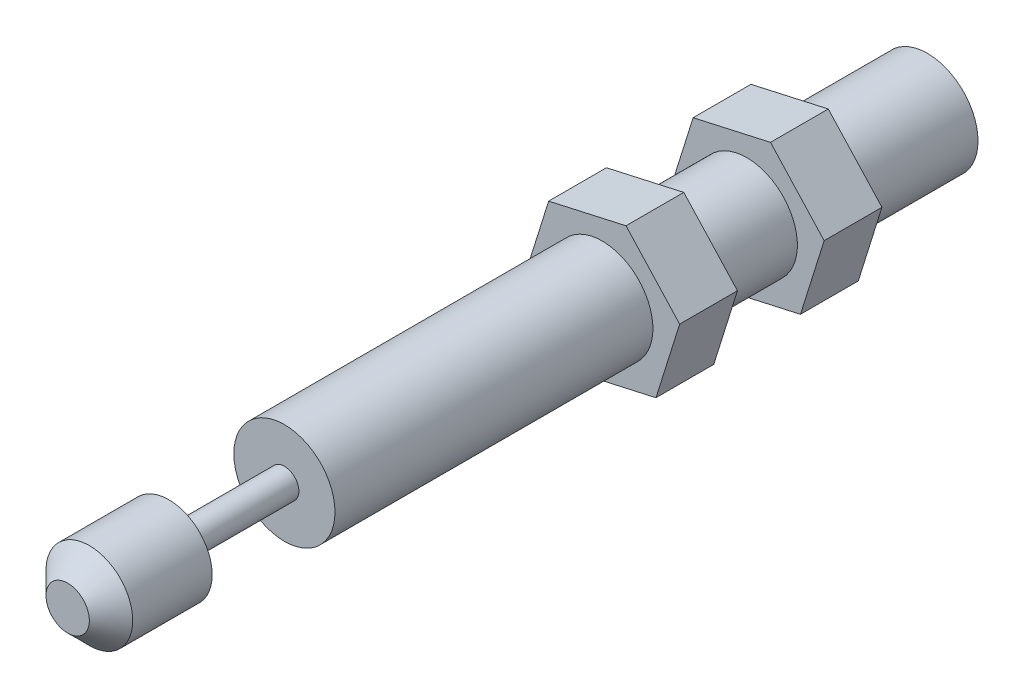
ISO-10303-21;
HEADER;
FILE_DESCRIPTION(('STEP AP214'),'2;1');
FILE_NAME('part.step','',(''),(''),'','','');
FILE_SCHEMA(('AUTOMOTIVE_DESIGN { 1 0 10303 214 1 1 1 1 }'));
ENDSEC;
DATA;
#1=APPLICATION_CONTEXT('core data for automotive mechanical design processes');
#2=APPLICATION_PROTOCOL_DEFINITION('international standard','automotive_design',2000,#1);
#3=PRODUCT_CONTEXT('',#1,'mechanical');
#4=PRODUCT('Part','Part','',(#3));
#5=PRODUCT_RELATED_PRODUCT_CATEGORY('part','',(#4));
#6=PRODUCT_DEFINITION_FORMATION('','',#4);
#7=PRODUCT_DEFINITION_CONTEXT('part definition',#1,'design');
#8=PRODUCT_DEFINITION('design','',#6,#7);
#9=PRODUCT_DEFINITION_SHAPE('','',#8);
#10=(LENGTH_UNIT() NAMED_UNIT(*) SI_UNIT(.MILLI.,.METRE.));
#11=(NAMED_UNIT(*) PLANE_ANGLE_UNIT() SI_UNIT($,.RADIAN.));
#12=(NAMED_UNIT(*) SI_UNIT($,.STERADIAN.) SOLID_ANGLE_UNIT());
#13=UNCERTAINTY_MEASURE_WITH_UNIT(LENGTH_MEASURE(1.E-05),#10,'distance_accuracy_value','');
#14=(GEOMETRIC_REPRESENTATION_CONTEXT(3) GLOBAL_UNCERTAINTY_ASSIGNED_CONTEXT((#13)) GLOBAL_UNIT_ASSIGNED_CONTEXT((#10,
#11,#12)) REPRESENTATION_CONTEXT('',''));
#15=CARTESIAN_POINT('',(0.,0.,0.));
#16=DIRECTION('',(0.,0.,1.));
#17=DIRECTION('',(1.,0.,0.));
#18=AXIS2_PLACEMENT_3D('',#15,#16,#17);
#19=CARTESIAN_POINT('',(0.,0.,89.));
#20=DIRECTION('',(0.,0.,-1.));
#21=DIRECTION('',(-1.,0.,0.));
#22=AXIS2_PLACEMENT_3D('',#19,#20,#21);
#23=CYLINDRICAL_SURFACE('',#22,7.);
#24=CARTESIAN_POINT('',(0.,0.,89.));
#25=DIRECTION('',(0.,0.,1.));
#26=DIRECTION('',(1.,0.,0.));
#27=AXIS2_PLACEMENT_3D('',#24,#25,#26);
#28=CIRCLE('',#27,7.);
#29=CARTESIAN_POINT('',(7.,0.,89.));
#30=VERTEX_POINT('',#29);
#31=EDGE_CURVE('E156',#30,#30,#28,.T.);
#32=ORIENTED_EDGE('',*,*,#31,.F.);
#33=EDGE_LOOP('',(#32));
#34=FACE_BOUND('',#33,.T.);
#35=CARTESIAN_POINT('',(0.,0.,45.));
#36=DIRECTION('',(0.,0.,-1.));
#37=DIRECTION('',(-1.,0.,0.));
#38=AXIS2_PLACEMENT_3D('',#35,#36,#37);
#39=CIRCLE('',#38,7.);
#40=CARTESIAN_POINT('',(-7.,0.,45.));
#41=VERTEX_POINT('',#40);
#42=EDGE_CURVE('E11',#41,#41,#39,.T.);
#43=ORIENTED_EDGE('',*,*,#42,.F.);
#44=EDGE_LOOP('',(#43));
#45=FACE_BOUND('',#44,.T.);
#46=ADVANCED_FACE('F34',(#34,#45),#23,.T.);
#47=CARTESIAN_POINT('',(0.,0.,89.));
#48=DIRECTION('',(0.,0.,1.));
#49=DIRECTION('',(1.,0.,0.));
#50=AXIS2_PLACEMENT_3D('',#47,#48,#49);
#51=PLANE('',#50);
#52=ORIENTED_EDGE('',*,*,#31,.T.);
#53=EDGE_LOOP('',(#52));
#54=FACE_BOUND('',#53,.T.);
#55=CARTESIAN_POINT('',(0.,0.,89.));
#56=DIRECTION('',(0.,0.,1.));
#57=DIRECTION('',(1.,0.,0.));
#58=AXIS2_PLACEMENT_3D('',#55,#56,#57);
#59=CIRCLE('',#58,2.);
#60=CARTESIAN_POINT('',(2.,0.,89.));
#61=VERTEX_POINT('',#60);
#62=EDGE_CURVE('E149',#61,#61,#59,.T.);
#63=ORIENTED_EDGE('',*,*,#62,.F.);
#64=EDGE_LOOP('',(#63));
#65=FACE_BOUND('',#64,.T.);
#66=ADVANCED_FACE('F188',(#54,#65),#51,.T.);
#67=CARTESIAN_POINT('',(0.,0.,105.));
#68=DIRECTION('',(0.,0.,-1.));
#69=DIRECTION('',(-1.,0.,0.));
#70=AXIS2_PLACEMENT_3D('',#67,#68,#69);
#71=CYLINDRICAL_SURFACE('',#70,2.);
#72=CARTESIAN_POINT('',(0.,0.,105.));
#73=DIRECTION('',(0.,0.,1.));
#74=DIRECTION('',(1.,0.,0.));
#75=AXIS2_PLACEMENT_3D('',#72,#73,#74);
#76=CIRCLE('',#75,2.);
#77=CARTESIAN_POINT('',(2.,0.,105.));
#78=VERTEX_POINT('',#77);
#79=EDGE_CURVE('E150',#78,#78,#76,.T.);
#80=ORIENTED_EDGE('',*,*,#79,.F.);
#81=EDGE_LOOP('',(#80));
#82=FACE_BOUND('',#81,.T.);
#83=ORIENTED_EDGE('',*,*,#62,.T.);
#84=EDGE_LOOP('',(#83));
#85=FACE_BOUND('',#84,.T.);
#86=ADVANCED_FACE('F193',(#82,#85),#71,.T.);
#87=CARTESIAN_POINT('',(0.,0.,105.));
#88=DIRECTION('',(0.,0.,1.));
#89=DIRECTION('',(1.,0.,0.));
#90=AXIS2_PLACEMENT_3D('',#87,#88,#89);
#91=PLANE('',#90);
#92=CARTESIAN_POINT('',(0.,0.,105.));
#93=DIRECTION('',(0.,0.,1.));
#94=DIRECTION('',(1.,0.,0.));
#95=AXIS2_PLACEMENT_3D('',#92,#93,#94);
#96=CIRCLE('',#95,6.);
#97=CARTESIAN_POINT('',(6.,0.,105.));
#98=VERTEX_POINT('',#97);
#99=EDGE_CURVE('E146',#98,#98,#96,.T.);
#100=ORIENTED_EDGE('',*,*,#99,.F.);
#101=EDGE_LOOP('',(#100));
#102=FACE_BOUND('',#101,.T.);
#103=ORIENTED_EDGE('',*,*,#79,.T.);
#104=EDGE_LOOP('',(#103));
#105=FACE_BOUND('',#104,.T.);
#106=ADVANCED_FACE('F254',(#102,#105),#91,.F.);
#107=CARTESIAN_POINT('',(0.,0.,119.));
#108=DIRECTION('',(0.,0.,-1.));
#109=DIRECTION('',(-1.,0.,0.));
#110=AXIS2_PLACEMENT_3D('',#107,#108,#109);
#111=CYLINDRICAL_SURFACE('',#110,6.);
#112=CARTESIAN_POINT('',(0.,0.,116.));
#113=DIRECTION('',(0.,0.,1.));
#114=DIRECTION('',(1.,0.,0.));
#115=AXIS2_PLACEMENT_3D('',#112,#113,#114);
#116=CIRCLE('',#115,6.);
#117=CARTESIAN_POINT('',(6.,0.,116.));
#118=VERTEX_POINT('',#117);
#119=EDGE_CURVE('E164',#118,#118,#116,.F.);
#120=ORIENTED_EDGE('',*,*,#119,.T.);
#121=EDGE_LOOP('',(#120));
#122=FACE_BOUND('',#121,.T.);
#123=ORIENTED_EDGE('',*,*,#99,.T.);
#124=EDGE_LOOP('',(#123));
#125=FACE_BOUND('',#124,.T.);
#126=ADVANCED_FACE('F252',(#122,#125),#111,.T.);
#127=CARTESIAN_POINT('',(0.,0.,119.));
#128=DIRECTION('',(0.,0.,1.));
#129=DIRECTION('',(1.,0.,0.));
#130=AXIS2_PLACEMENT_3D('',#127,#128,#129);
#131=PLANE('',#130);
#132=CARTESIAN_POINT('',(0.,0.,119.));
#133=DIRECTION('',(0.,0.,1.));
#134=DIRECTION('',(1.,0.,0.));
#135=AXIS2_PLACEMENT_3D('',#132,#133,#134);
#136=CIRCLE('',#135,2.99999999999996);
#137=CARTESIAN_POINT('',(2.99999999999996,0.,119.));
#138=VERTEX_POINT('',#137);
#139=EDGE_CURVE('E159',#138,#138,#136,.T.);
#140=ORIENTED_EDGE('',*,*,#139,.T.);
#141=EDGE_LOOP('',(#140));
#142=FACE_BOUND('',#141,.T.);
#143=ADVANCED_FACE('F249',(#142),#131,.T.);
#144=CARTESIAN_POINT('',(0.,0.,119.));
#145=DIRECTION('',(0.,0.,-1.));
#146=DIRECTION('',(-1.,0.,0.));
#147=AXIS2_PLACEMENT_3D('',#144,#145,#146);
#148=CONICAL_SURFACE('',#147,2.99999999999996,0.785398163397448);
#149=ORIENTED_EDGE('',*,*,#119,.F.);
#150=EDGE_LOOP('',(#149));
#151=FACE_BOUND('',#150,.T.);
#152=ORIENTED_EDGE('',*,*,#139,.F.);
#153=EDGE_LOOP('',(#152));
#154=FACE_BOUND('',#153,.T.);
#155=ADVANCED_FACE('F36',(#151,#154),#148,.T.);
#156=CARTESIAN_POINT('',(3.27780569084184,10.4684919251255,37.));
#157=DIRECTION('',(0.,0.,-1.));
#158=DIRECTION('',(-1.,0.,0.));
#159=AXIS2_PLACEMENT_3D('',#156,#157,#158);
#160=PLANE('',#159);
#161=DIRECTION('',(0.975863204454027,0.218382705800432,0.));
#162=VECTOR('',#161,1.);
#163=CARTESIAN_POINT('',(-7.42707710105005,8.07290895950099,37.));
#164=LINE('',#163,#162);
#165=CARTESIAN_POINT('',(-7.42707710105005,8.07290895950099,37.));
#166=VERTEX_POINT('',#165);
#167=CARTESIAN_POINT('',(3.27780569084183,10.4684919251255,37.));
#168=VERTEX_POINT('',#167);
#169=EDGE_CURVE('E330',#166,#168,#164,.T.);
#170=ORIENTED_EDGE('',*,*,#169,.T.);
#171=DIRECTION('',(0.677056573197371,-0.735930972775459,0.));
#172=VECTOR('',#171,1.);
#173=CARTESIAN_POINT('',(3.27780569084183,10.4684919251255,37.));
#174=LINE('',#173,#172);
#175=CARTESIAN_POINT('',(10.7048827918919,2.39558296562453,37.));
#176=VERTEX_POINT('',#175);
#177=EDGE_CURVE('E370',#168,#176,#174,.T.);
#178=ORIENTED_EDGE('',*,*,#177,.T.);
#179=DIRECTION('',(-0.298806631256656,-0.954313678575891,0.));
#180=VECTOR('',#179,1.);
#181=CARTESIAN_POINT('',(10.7048827918919,2.39558296562453,37.));
#182=LINE('',#181,#180);
#183=CARTESIAN_POINT('',(7.42707710105005,-8.07290895950099,37.));
#184=VERTEX_POINT('',#183);
#185=EDGE_CURVE('E365',#176,#184,#182,.T.);
#186=ORIENTED_EDGE('',*,*,#185,.T.);
#187=DIRECTION('',(-0.975863204454027,-0.218382705800433,0.));
#188=VECTOR('',#187,1.);
#189=CARTESIAN_POINT('',(7.42707710105005,-8.07290895950099,37.));
#190=LINE('',#189,#188);
#191=CARTESIAN_POINT('',(-3.27780569084183,-10.4684919251255,37.));
#192=VERTEX_POINT('',#191);
#193=EDGE_CURVE('E346',#184,#192,#190,.T.);
#194=ORIENTED_EDGE('',*,*,#193,.T.);
#195=DIRECTION('',(-0.677056573197371,0.735930972775459,0.));
#196=VECTOR('',#195,1.);
#197=CARTESIAN_POINT('',(-3.27780569084183,-10.4684919251255,37.));
#198=LINE('',#197,#196);
#199=CARTESIAN_POINT('',(-10.7048827918919,-2.39558296562453,37.));
#200=VERTEX_POINT('',#199);
#201=EDGE_CURVE('E364',#192,#200,#198,.T.);
#202=ORIENTED_EDGE('',*,*,#201,.T.);
#203=DIRECTION('',(0.298806631256656,0.954313678575891,0.));
#204=VECTOR('',#203,1.);
#205=CARTESIAN_POINT('',(-10.7048827918919,-2.39558296562453,37.));
#206=LINE('',#205,#204);
#207=EDGE_CURVE('E317',#200,#166,#206,.T.);
#208=ORIENTED_EDGE('',*,*,#207,.T.);
#209=EDGE_LOOP('',(#170,#178,#186,#194,#202,#208));
#210=FACE_BOUND('',#209,.T.);
#211=CARTESIAN_POINT('',(0.,0.,37.));
#212=DIRECTION('',(0.,0.,-1.));
#213=DIRECTION('',(-1.,0.,0.));
#214=AXIS2_PLACEMENT_3D('',#211,#212,#213);
#215=CIRCLE('',#214,7.);
#216=CARTESIAN_POINT('',(-7.,0.,37.));
#217=VERTEX_POINT('',#216);
#218=EDGE_CURVE('E38',#217,#217,#215,.T.);
#219=ORIENTED_EDGE('',*,*,#218,.F.);
#220=EDGE_LOOP('',(#219));
#221=FACE_BOUND('',#220,.T.);
#222=ADVANCED_FACE('F299',(#210,#221),#160,.T.);
#223=CARTESIAN_POINT('',(3.27780569084184,10.4684919251255,45.));
#224=DIRECTION('',(0.,0.,-1.));
#225=DIRECTION('',(-1.,0.,0.));
#226=AXIS2_PLACEMENT_3D('',#223,#224,#225);
#227=PLANE('',#226);
#228=DIRECTION('',(0.975863204454027,0.218382705800432,0.));
#229=VECTOR('',#228,1.);
#230=CARTESIAN_POINT('',(-7.42707710105005,8.07290895950099,45.));
#231=LINE('',#230,#229);
#232=CARTESIAN_POINT('',(-7.42707710105005,8.07290895950099,45.));
#233=VERTEX_POINT('',#232);
#234=CARTESIAN_POINT('',(3.27780569084183,10.4684919251255,45.));
#235=VERTEX_POINT('',#234);
#236=EDGE_CURVE('E303',#233,#235,#231,.T.);
#237=ORIENTED_EDGE('',*,*,#236,.F.);
#238=DIRECTION('',(0.298806631256656,0.954313678575891,0.));
#239=VECTOR('',#238,1.);
#240=CARTESIAN_POINT('',(-10.7048827918919,-2.39558296562453,45.));
#241=LINE('',#240,#239);
#242=CARTESIAN_POINT('',(-10.7048827918919,-2.39558296562453,45.));
#243=VERTEX_POINT('',#242);
#244=EDGE_CURVE('E328',#243,#233,#241,.T.);
#245=ORIENTED_EDGE('',*,*,#244,.F.);
#246=DIRECTION('',(-0.677056573197371,0.735930972775459,0.));
#247=VECTOR('',#246,1.);
#248=CARTESIAN_POINT('',(-3.27780569084183,-10.4684919251255,45.));
#249=LINE('',#248,#247);
#250=CARTESIAN_POINT('',(-3.27780569084183,-10.4684919251255,45.));
#251=VERTEX_POINT('',#250);
#252=EDGE_CURVE('E325',#251,#243,#249,.T.);
#253=ORIENTED_EDGE('',*,*,#252,.F.);
#254=DIRECTION('',(-0.975863204454027,-0.218382705800433,0.));
#255=VECTOR('',#254,1.);
#256=CARTESIAN_POINT('',(7.42707710105005,-8.07290895950099,45.));
#257=LINE('',#256,#255);
#258=CARTESIAN_POINT('',(7.42707710105005,-8.07290895950099,45.));
#259=VERTEX_POINT('',#258);
#260=EDGE_CURVE('E322',#259,#251,#257,.T.);
#261=ORIENTED_EDGE('',*,*,#260,.F.);
#262=DIRECTION('',(-0.298806631256656,-0.954313678575891,0.));
#263=VECTOR('',#262,1.);
#264=CARTESIAN_POINT('',(10.7048827918919,2.39558296562453,45.));
#265=LINE('',#264,#263);
#266=CARTESIAN_POINT('',(10.7048827918919,2.39558296562453,45.));
#267=VERTEX_POINT('',#266);
#268=EDGE_CURVE('E314',#267,#259,#265,.T.);
#269=ORIENTED_EDGE('',*,*,#268,.F.);
#270=DIRECTION('',(0.677056573197371,-0.735930972775459,0.));
#271=VECTOR('',#270,1.);
#272=CARTESIAN_POINT('',(3.27780569084183,10.4684919251255,45.));
#273=LINE('',#272,#271);
#274=EDGE_CURVE('E312',#235,#267,#273,.T.);
#275=ORIENTED_EDGE('',*,*,#274,.F.);
#276=EDGE_LOOP('',(#237,#245,#253,#261,#269,#275));
#277=FACE_BOUND('',#276,.T.);
#278=ORIENTED_EDGE('',*,*,#42,.T.);
#279=EDGE_LOOP('',(#278));
#280=FACE_BOUND('',#279,.T.);
#281=ADVANCED_FACE('F281',(#277,#280),#227,.F.);
#282=CARTESIAN_POINT('',(-7.42707710105005,8.07290895950099,37.));
#283=DIRECTION('',(0.218382705800432,-0.975863204454027,0.));
#284=DIRECTION('',(0.975863204454027,0.218382705800432,0.));
#285=AXIS2_PLACEMENT_3D('',#282,#283,#284);
#286=PLANE('',#285);
#287=ORIENTED_EDGE('',*,*,#236,.T.);
#288=DIRECTION('',(0.,0.,1.));
#289=VECTOR('',#288,1.);
#290=CARTESIAN_POINT('',(3.27780569084183,10.4684919251255,37.));
#291=LINE('',#290,#289);
#292=EDGE_CURVE('E213',#168,#235,#291,.T.);
#293=ORIENTED_EDGE('',*,*,#292,.F.);
#294=ORIENTED_EDGE('',*,*,#169,.F.);
#295=DIRECTION('',(0.,0.,1.));
#296=VECTOR('',#295,1.);
#297=CARTESIAN_POINT('',(-7.42707710105005,8.07290895950099,37.));
#298=LINE('',#297,#296);
#299=EDGE_CURVE('E307',#166,#233,#298,.T.);
#300=ORIENTED_EDGE('',*,*,#299,.T.);
#301=EDGE_LOOP('',(#287,#293,#294,#300));
#302=FACE_BOUND('',#301,.T.);
#303=ADVANCED_FACE('F293',(#302),#286,.F.);
#304=CARTESIAN_POINT('',(3.27780569084183,10.4684919251255,37.));
#305=DIRECTION('',(-0.735930972775459,-0.677056573197371,0.));
#306=DIRECTION('',(0.677056573197371,-0.735930972775459,0.));
#307=AXIS2_PLACEMENT_3D('',#304,#305,#306);
#308=PLANE('',#307);
#309=ORIENTED_EDGE('',*,*,#274,.T.);
#310=DIRECTION('',(0.,0.,1.));
#311=VECTOR('',#310,1.);
#312=CARTESIAN_POINT('',(10.7048827918919,2.39558296562453,37.));
#313=LINE('',#312,#311);
#314=EDGE_CURVE('E215',#176,#267,#313,.T.);
#315=ORIENTED_EDGE('',*,*,#314,.F.);
#316=ORIENTED_EDGE('',*,*,#177,.F.);
#317=ORIENTED_EDGE('',*,*,#292,.T.);
#318=EDGE_LOOP('',(#309,#315,#316,#317));
#319=FACE_BOUND('',#318,.T.);
#320=ADVANCED_FACE('F290',(#319),#308,.F.);
#321=CARTESIAN_POINT('',(10.7048827918919,2.39558296562453,37.));
#322=DIRECTION('',(-0.954313678575891,0.298806631256656,0.));
#323=DIRECTION('',(-0.298806631256656,-0.954313678575891,0.));
#324=AXIS2_PLACEMENT_3D('',#321,#322,#323);
#325=PLANE('',#324);
#326=ORIENTED_EDGE('',*,*,#268,.T.);
#327=DIRECTION('',(0.,0.,1.));
#328=VECTOR('',#327,1.);
#329=CARTESIAN_POINT('',(7.42707710105005,-8.07290895950099,37.));
#330=LINE('',#329,#328);
#331=EDGE_CURVE('E224',#184,#259,#330,.T.);
#332=ORIENTED_EDGE('',*,*,#331,.F.);
#333=ORIENTED_EDGE('',*,*,#185,.F.);
#334=ORIENTED_EDGE('',*,*,#314,.T.);
#335=EDGE_LOOP('',(#326,#332,#333,#334));
#336=FACE_BOUND('',#335,.T.);
#337=ADVANCED_FACE('F286',(#336),#325,.F.);
#338=CARTESIAN_POINT('',(7.42707710105005,-8.07290895950099,37.));
#339=DIRECTION('',(-0.218382705800433,0.975863204454027,0.));
#340=DIRECTION('',(-0.975863204454027,-0.218382705800433,0.));
#341=AXIS2_PLACEMENT_3D('',#338,#339,#340);
#342=PLANE('',#341);
#343=ORIENTED_EDGE('',*,*,#260,.T.);
#344=DIRECTION('',(0.,0.,1.));
#345=VECTOR('',#344,1.);
#346=CARTESIAN_POINT('',(-3.27780569084183,-10.4684919251255,37.));
#347=LINE('',#346,#345);
#348=EDGE_CURVE('E335',#192,#251,#347,.T.);
#349=ORIENTED_EDGE('',*,*,#348,.F.);
#350=ORIENTED_EDGE('',*,*,#193,.F.);
#351=ORIENTED_EDGE('',*,*,#331,.T.);
#352=EDGE_LOOP('',(#343,#349,#350,#351));
#353=FACE_BOUND('',#352,.T.);
#354=ADVANCED_FACE('F276',(#353),#342,.F.);
#355=CARTESIAN_POINT('',(-3.27780569084183,-10.4684919251255,37.));
#356=DIRECTION('',(0.735930972775459,0.677056573197371,0.));
#357=DIRECTION('',(-0.677056573197371,0.735930972775459,0.));
#358=AXIS2_PLACEMENT_3D('',#355,#356,#357);
#359=PLANE('',#358);
#360=ORIENTED_EDGE('',*,*,#252,.T.);
#361=DIRECTION('',(0.,0.,1.));
#362=VECTOR('',#361,1.);
#363=CARTESIAN_POINT('',(-10.7048827918919,-2.39558296562453,37.));
#364=LINE('',#363,#362);
#365=EDGE_CURVE('E332',#200,#243,#364,.T.);
#366=ORIENTED_EDGE('',*,*,#365,.F.);
#367=ORIENTED_EDGE('',*,*,#201,.F.);
#368=ORIENTED_EDGE('',*,*,#348,.T.);
#369=EDGE_LOOP('',(#360,#366,#367,#368));
#370=FACE_BOUND('',#369,.T.);
#371=ADVANCED_FACE('F269',(#370),#359,.F.);
#372=CARTESIAN_POINT('',(-10.7048827918919,-2.39558296562453,37.));
#373=DIRECTION('',(0.954313678575891,-0.298806631256656,0.));
#374=DIRECTION('',(0.298806631256656,0.954313678575891,0.));
#375=AXIS2_PLACEMENT_3D('',#372,#373,#374);
#376=PLANE('',#375);
#377=ORIENTED_EDGE('',*,*,#244,.T.);
#378=ORIENTED_EDGE('',*,*,#299,.F.);
#379=ORIENTED_EDGE('',*,*,#207,.F.);
#380=ORIENTED_EDGE('',*,*,#365,.T.);
#381=EDGE_LOOP('',(#377,#378,#379,#380));
#382=FACE_BOUND('',#381,.T.);
#383=ADVANCED_FACE('F264',(#382),#376,.F.);
#384=CARTESIAN_POINT('',(0.,0.,0.));
#385=DIRECTION('',(0.,0.,1.));
#386=DIRECTION('',(1.,0.,0.));
#387=AXIS2_PLACEMENT_3D('',#384,#385,#386);
#388=PLANE('',#387);
#389=CARTESIAN_POINT('',(0.,0.,0.));
#390=DIRECTION('',(0.,0.,1.));
#391=DIRECTION('',(1.,0.,0.));
#392=AXIS2_PLACEMENT_3D('',#389,#390,#391);
#393=CIRCLE('',#392,7.);
#394=CARTESIAN_POINT('',(7.,0.,0.));
#395=VERTEX_POINT('',#394);
#396=EDGE_CURVE('E153',#395,#395,#393,.T.);
#397=ORIENTED_EDGE('',*,*,#396,.F.);
#398=EDGE_LOOP('',(#397));
#399=FACE_BOUND('',#398,.T.);
#400=ADVANCED_FACE('F183',(#399),#388,.F.);
#401=CARTESIAN_POINT('',(0.,0.,17.));
#402=DIRECTION('',(0.,0.,-1.));
#403=DIRECTION('',(-1.,0.,0.));
#404=AXIS2_PLACEMENT_3D('',#401,#402,#403);
#405=CIRCLE('',#404,7.);
#406=CARTESIAN_POINT('',(-7.,0.,17.));
#407=VERTEX_POINT('',#406);
#408=EDGE_CURVE('E145',#407,#407,#405,.T.);
#409=ORIENTED_EDGE('',*,*,#408,.T.);
#410=EDGE_LOOP('',(#409));
#411=FACE_BOUND('',#410,.T.);
#412=ORIENTED_EDGE('',*,*,#396,.T.);
#413=EDGE_LOOP('',(#412));
#414=FACE_BOUND('',#413,.T.);
#415=ADVANCED_FACE('F172',(#411,#414),#23,.T.);
#416=CARTESIAN_POINT('',(3.27780569084184,10.4684919251255,17.));
#417=DIRECTION('',(0.,0.,-1.));
#418=DIRECTION('',(-1.,0.,0.));
#419=AXIS2_PLACEMENT_3D('',#416,#417,#418);
#420=PLANE('',#419);
#421=DIRECTION('',(0.975863204454027,0.218382705800432,0.));
#422=VECTOR('',#421,1.);
#423=CARTESIAN_POINT('',(-7.42707710105005,8.07290895950099,17.));
#424=LINE('',#423,#422);
#425=CARTESIAN_POINT('',(-7.42707710105005,8.07290895950099,17.));
#426=VERTEX_POINT('',#425);
#427=CARTESIAN_POINT('',(3.27780569084183,10.4684919251255,17.));
#428=VERTEX_POINT('',#427);
#429=EDGE_CURVE('E136',#426,#428,#424,.T.);
#430=ORIENTED_EDGE('',*,*,#429,.T.);
#431=DIRECTION('',(0.677056573197371,-0.735930972775459,0.));
#432=VECTOR('',#431,1.);
#433=CARTESIAN_POINT('',(3.27780569084183,10.4684919251255,17.));
#434=LINE('',#433,#432);
#435=CARTESIAN_POINT('',(10.7048827918919,2.39558296562453,17.));
#436=VERTEX_POINT('',#435);
#437=EDGE_CURVE('E91',#428,#436,#434,.T.);
#438=ORIENTED_EDGE('',*,*,#437,.T.);
#439=DIRECTION('',(-0.298806631256656,-0.954313678575891,0.));
#440=VECTOR('',#439,1.);
#441=CARTESIAN_POINT('',(10.7048827918919,2.39558296562453,17.));
#442=LINE('',#441,#440);
#443=CARTESIAN_POINT('',(7.42707710105005,-8.07290895950099,17.));
#444=VERTEX_POINT('',#443);
#445=EDGE_CURVE('E108',#436,#444,#442,.T.);
#446=ORIENTED_EDGE('',*,*,#445,.T.);
#447=DIRECTION('',(-0.975863204454027,-0.218382705800433,0.));
#448=VECTOR('',#447,1.);
#449=CARTESIAN_POINT('',(7.42707710105005,-8.07290895950099,17.));
#450=LINE('',#449,#448);
#451=CARTESIAN_POINT('',(-3.27780569084183,-10.4684919251255,17.));
#452=VERTEX_POINT('',#451);
#453=EDGE_CURVE('E101',#444,#452,#450,.T.);
#454=ORIENTED_EDGE('',*,*,#453,.T.);
#455=DIRECTION('',(-0.677056573197371,0.735930972775459,0.));
#456=VECTOR('',#455,1.);
#457=CARTESIAN_POINT('',(-3.27780569084183,-10.4684919251255,17.));
#458=LINE('',#457,#456);
#459=CARTESIAN_POINT('',(-10.7048827918919,-2.39558296562453,17.));
#460=VERTEX_POINT('',#459);
#461=EDGE_CURVE('E106',#452,#460,#458,.T.);
#462=ORIENTED_EDGE('',*,*,#461,.T.);
#463=DIRECTION('',(0.298806631256656,0.954313678575891,0.));
#464=VECTOR('',#463,1.);
#465=CARTESIAN_POINT('',(-10.7048827918919,-2.39558296562453,17.));
#466=LINE('',#465,#464);
#467=EDGE_CURVE('E52',#460,#426,#466,.T.);
#468=ORIENTED_EDGE('',*,*,#467,.T.);
#469=EDGE_LOOP('',(#430,#438,#446,#454,#462,#468));
#470=FACE_BOUND('',#469,.T.);
#471=ORIENTED_EDGE('',*,*,#408,.F.);
#472=EDGE_LOOP('',(#471));
#473=FACE_BOUND('',#472,.T.);
#474=ADVANCED_FACE('F103',(#470,#473),#420,.T.);
#475=CARTESIAN_POINT('',(3.27780569084183,10.4684919251255,17.));
#476=DIRECTION('',(-0.735930972775459,-0.677056573197371,0.));
#477=DIRECTION('',(0.677056573197371,-0.735930972775459,0.));
#478=AXIS2_PLACEMENT_3D('',#475,#476,#477);
#479=PLANE('',#478);
#480=DIRECTION('',(0.677056573197371,-0.735930972775459,0.));
#481=VECTOR('',#480,1.);
#482=CARTESIAN_POINT('',(3.27780569084183,10.4684919251255,25.));
#483=LINE('',#482,#481);
#484=CARTESIAN_POINT('',(3.27780569084183,10.4684919251255,25.));
#485=VERTEX_POINT('',#484);
#486=CARTESIAN_POINT('',(10.7048827918919,2.39558296562453,25.));
#487=VERTEX_POINT('',#486);
#488=EDGE_CURVE('E129',#485,#487,#483,.T.);
#489=ORIENTED_EDGE('',*,*,#488,.T.);
#490=DIRECTION('',(0.,0.,1.));
#491=VECTOR('',#490,1.);
#492=CARTESIAN_POINT('',(10.7048827918919,2.39558296562453,17.));
#493=LINE('',#492,#491);
#494=EDGE_CURVE('E140',#436,#487,#493,.T.);
#495=ORIENTED_EDGE('',*,*,#494,.F.);
#496=ORIENTED_EDGE('',*,*,#437,.F.);
#497=DIRECTION('',(0.,0.,1.));
#498=VECTOR('',#497,1.);
#499=CARTESIAN_POINT('',(3.27780569084183,10.4684919251255,17.));
#500=LINE('',#499,#498);
#501=EDGE_CURVE('E143',#428,#485,#500,.T.);
#502=ORIENTED_EDGE('',*,*,#501,.T.);
#503=EDGE_LOOP('',(#489,#495,#496,#502));
#504=FACE_BOUND('',#503,.T.);
#505=ADVANCED_FACE('F175',(#504),#479,.F.);
#506=CARTESIAN_POINT('',(10.7048827918919,2.39558296562453,17.));
#507=DIRECTION('',(-0.954313678575891,0.298806631256656,0.));
#508=DIRECTION('',(-0.298806631256656,-0.954313678575891,0.));
#509=AXIS2_PLACEMENT_3D('',#506,#507,#508);
#510=PLANE('',#509);
#511=DIRECTION('',(-0.298806631256656,-0.954313678575891,0.));
#512=VECTOR('',#511,1.);
#513=CARTESIAN_POINT('',(10.7048827918919,2.39558296562453,25.));
#514=LINE('',#513,#512);
#515=CARTESIAN_POINT('',(7.42707710105005,-8.07290895950099,25.));
#516=VERTEX_POINT('',#515);
#517=EDGE_CURVE('E131',#487,#516,#514,.T.);
#518=ORIENTED_EDGE('',*,*,#517,.T.);
#519=DIRECTION('',(0.,0.,1.));
#520=VECTOR('',#519,1.);
#521=CARTESIAN_POINT('',(7.42707710105005,-8.07290895950099,17.));
#522=LINE('',#521,#520);
#523=EDGE_CURVE('E117',#444,#516,#522,.T.);
#524=ORIENTED_EDGE('',*,*,#523,.F.);
#525=ORIENTED_EDGE('',*,*,#445,.F.);
#526=ORIENTED_EDGE('',*,*,#494,.T.);
#527=EDGE_LOOP('',(#518,#524,#525,#526));
#528=FACE_BOUND('',#527,.T.);
#529=ADVANCED_FACE('F181',(#528),#510,.F.);
#530=CARTESIAN_POINT('',(7.42707710105005,-8.07290895950099,17.));
#531=DIRECTION('',(-0.218382705800433,0.975863204454027,0.));
#532=DIRECTION('',(-0.975863204454027,-0.218382705800433,0.));
#533=AXIS2_PLACEMENT_3D('',#530,#531,#532);
#534=PLANE('',#533);
#535=DIRECTION('',(-0.975863204454027,-0.218382705800433,0.));
#536=VECTOR('',#535,1.);
#537=CARTESIAN_POINT('',(7.42707710105005,-8.07290895950099,25.));
#538=LINE('',#537,#536);
#539=CARTESIAN_POINT('',(-3.27780569084183,-10.4684919251255,25.));
#540=VERTEX_POINT('',#539);
#541=EDGE_CURVE('E116',#516,#540,#538,.T.);
#542=ORIENTED_EDGE('',*,*,#541,.T.);
#543=DIRECTION('',(0.,0.,1.));
#544=VECTOR('',#543,1.);
#545=CARTESIAN_POINT('',(-3.27780569084183,-10.4684919251255,17.));
#546=LINE('',#545,#544);
#547=EDGE_CURVE('E113',#452,#540,#546,.T.);
#548=ORIENTED_EDGE('',*,*,#547,.F.);
#549=ORIENTED_EDGE('',*,*,#453,.F.);
#550=ORIENTED_EDGE('',*,*,#523,.T.);
#551=EDGE_LOOP('',(#542,#548,#549,#550));
#552=FACE_BOUND('',#551,.T.);
#553=ADVANCED_FACE('F114',(#552),#534,.F.);
#554=CARTESIAN_POINT('',(-3.27780569084183,-10.4684919251255,17.));
#555=DIRECTION('',(0.735930972775459,0.677056573197371,0.));
#556=DIRECTION('',(-0.677056573197371,0.735930972775459,0.));
#557=AXIS2_PLACEMENT_3D('',#554,#555,#556);
#558=PLANE('',#557);
#559=DIRECTION('',(-0.677056573197371,0.735930972775459,0.));
#560=VECTOR('',#559,1.);
#561=CARTESIAN_POINT('',(-3.27780569084183,-10.4684919251255,25.));
#562=LINE('',#561,#560);
#563=CARTESIAN_POINT('',(-10.7048827918919,-2.39558296562453,25.));
#564=VERTEX_POINT('',#563);
#565=EDGE_CURVE('E76',#540,#564,#562,.T.);
#566=ORIENTED_EDGE('',*,*,#565,.T.);
#567=DIRECTION('',(0.,0.,1.));
#568=VECTOR('',#567,1.);
#569=CARTESIAN_POINT('',(-10.7048827918919,-2.39558296562453,17.));
#570=LINE('',#569,#568);
#571=EDGE_CURVE('E118',#460,#564,#570,.T.);
#572=ORIENTED_EDGE('',*,*,#571,.F.);
#573=ORIENTED_EDGE('',*,*,#461,.F.);
#574=ORIENTED_EDGE('',*,*,#547,.T.);
#575=EDGE_LOOP('',(#566,#572,#573,#574));
#576=FACE_BOUND('',#575,.T.);
#577=ADVANCED_FACE('F120',(#576),#558,.F.);
#578=CARTESIAN_POINT('',(-10.7048827918919,-2.39558296562453,17.));
#579=DIRECTION('',(0.954313678575891,-0.298806631256656,0.));
#580=DIRECTION('',(0.298806631256656,0.954313678575891,0.));
#581=AXIS2_PLACEMENT_3D('',#578,#579,#580);
#582=PLANE('',#581);
#583=DIRECTION('',(0.298806631256656,0.954313678575891,0.));
#584=VECTOR('',#583,1.);
#585=CARTESIAN_POINT('',(-10.7048827918919,-2.39558296562453,25.));
#586=LINE('',#585,#584);
#587=CARTESIAN_POINT('',(-7.42707710105005,8.07290895950099,25.));
#588=VERTEX_POINT('',#587);
#589=EDGE_CURVE('E82',#564,#588,#586,.T.);
#590=ORIENTED_EDGE('',*,*,#589,.T.);
#591=DIRECTION('',(0.,0.,1.));
#592=VECTOR('',#591,1.);
#593=CARTESIAN_POINT('',(-7.42707710105005,8.07290895950099,17.));
#594=LINE('',#593,#592);
#595=EDGE_CURVE('E122',#426,#588,#594,.T.);
#596=ORIENTED_EDGE('',*,*,#595,.F.);
#597=ORIENTED_EDGE('',*,*,#467,.F.);
#598=ORIENTED_EDGE('',*,*,#571,.T.);
#599=EDGE_LOOP('',(#590,#596,#597,#598));
#600=FACE_BOUND('',#599,.T.);
#601=ADVANCED_FACE('F235',(#600),#582,.F.);
#602=CARTESIAN_POINT('',(-7.42707710105005,8.07290895950099,17.));
#603=DIRECTION('',(0.218382705800432,-0.975863204454027,0.));
#604=DIRECTION('',(0.975863204454027,0.218382705800432,0.));
#605=AXIS2_PLACEMENT_3D('',#602,#603,#604);
#606=PLANE('',#605);
#607=DIRECTION('',(0.975863204454027,0.218382705800432,0.));
#608=VECTOR('',#607,1.);
#609=CARTESIAN_POINT('',(-7.42707710105005,8.07290895950099,25.));
#610=LINE('',#609,#608);
#611=EDGE_CURVE('E126',#588,#485,#610,.T.);
#612=ORIENTED_EDGE('',*,*,#611,.T.);
#613=ORIENTED_EDGE('',*,*,#501,.F.);
#614=ORIENTED_EDGE('',*,*,#429,.F.);
#615=ORIENTED_EDGE('',*,*,#595,.T.);
#616=EDGE_LOOP('',(#612,#613,#614,#615));
#617=FACE_BOUND('',#616,.T.);
#618=ADVANCED_FACE('F205',(#617),#606,.F.);
#619=CARTESIAN_POINT('',(3.27780569084184,10.4684919251255,25.));
#620=DIRECTION('',(0.,0.,-1.));
#621=DIRECTION('',(-1.,0.,0.));
#622=AXIS2_PLACEMENT_3D('',#619,#620,#621);
#623=PLANE('',#622);
#624=ORIENTED_EDGE('',*,*,#611,.F.);
#625=ORIENTED_EDGE('',*,*,#589,.F.);
#626=ORIENTED_EDGE('',*,*,#565,.F.);
#627=ORIENTED_EDGE('',*,*,#541,.F.);
#628=ORIENTED_EDGE('',*,*,#517,.F.);
#629=ORIENTED_EDGE('',*,*,#488,.F.);
#630=EDGE_LOOP('',(#624,#625,#626,#627,#628,#629));
#631=FACE_BOUND('',#630,.T.);
#632=CARTESIAN_POINT('',(0.,0.,25.));
#633=DIRECTION('',(0.,0.,-1.));
#634=DIRECTION('',(-1.,0.,0.));
#635=AXIS2_PLACEMENT_3D('',#632,#633,#634);
#636=CIRCLE('',#635,7.);
#637=CARTESIAN_POINT('',(-7.,0.,25.));
#638=VERTEX_POINT('',#637);
#639=EDGE_CURVE('E44',#638,#638,#636,.T.);
#640=ORIENTED_EDGE('',*,*,#639,.T.);
#641=EDGE_LOOP('',(#640));
#642=FACE_BOUND('',#641,.T.);
#643=ADVANCED_FACE('F200',(#631,#642),#623,.F.);
#644=ORIENTED_EDGE('',*,*,#218,.T.);
#645=EDGE_LOOP('',(#644));
#646=FACE_BOUND('',#645,.T.);
#647=ORIENTED_EDGE('',*,*,#639,.F.);
#648=EDGE_LOOP('',(#647));
#649=FACE_BOUND('',#648,.T.);
#650=ADVANCED_FACE('F184',(#646,#649),#23,.T.);
#651=CLOSED_SHELL('',(#46,#66,#86,#106,#126,#143,#155,#222,#281,#303,#320,#337,#354,#371,#383,
#400,#415,#474,#505,#529,#553,#577,#601,#618,#643,#650));
#652=MANIFOLD_SOLID_BREP('B2',#651);
#653=ADVANCED_BREP_SHAPE_REPRESENTATION('',(#18,#652),#14);
#654=SHAPE_DEFINITION_REPRESENTATION(#9,#653);
ENDSEC;
END-ISO-10303-21;
